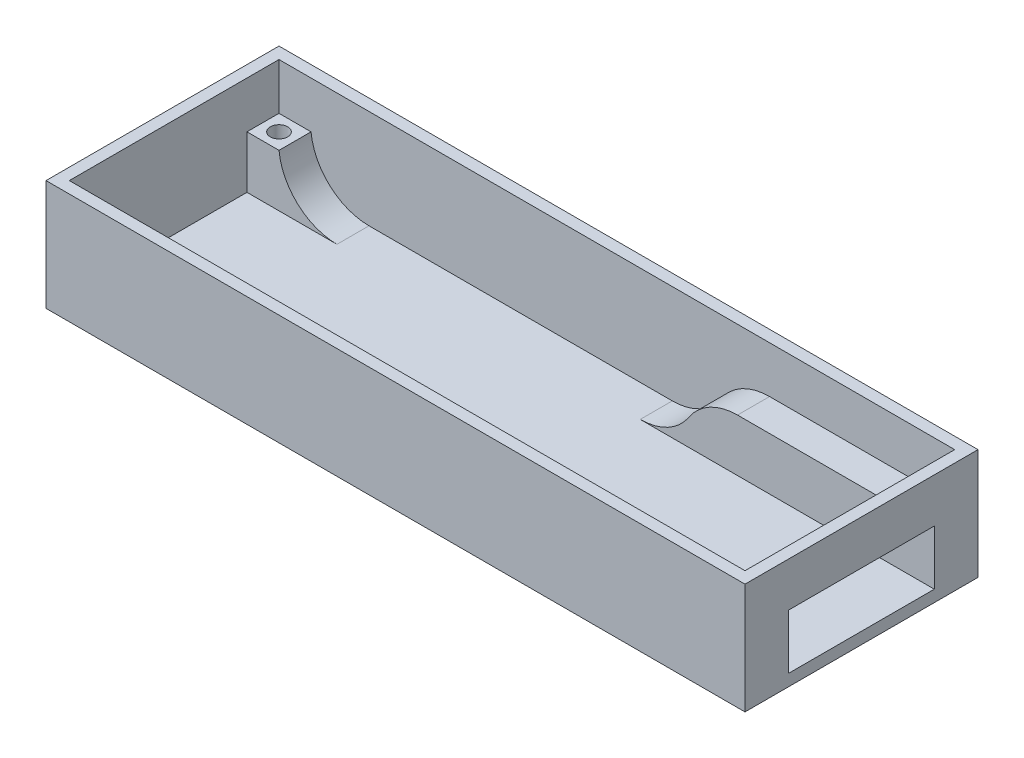
ISO-10303-21;
HEADER;
FILE_DESCRIPTION(('STEP AP214'),'2;1');
FILE_NAME('part.step','',(''),(''),'','','');
FILE_SCHEMA(('AUTOMOTIVE_DESIGN { 1 0 10303 214 1 1 1 1 }'));
ENDSEC;
DATA;
#1=APPLICATION_CONTEXT('core data for automotive mechanical design processes');
#2=APPLICATION_PROTOCOL_DEFINITION('international standard','automotive_design',2000,#1);
#3=PRODUCT_CONTEXT('',#1,'mechanical');
#4=PRODUCT('Part','Part','',(#3));
#5=PRODUCT_RELATED_PRODUCT_CATEGORY('part','',(#4));
#6=PRODUCT_DEFINITION_FORMATION('','',#4);
#7=PRODUCT_DEFINITION_CONTEXT('part definition',#1,'design');
#8=PRODUCT_DEFINITION('design','',#6,#7);
#9=PRODUCT_DEFINITION_SHAPE('','',#8);
#10=(LENGTH_UNIT() NAMED_UNIT(*) SI_UNIT(.MILLI.,.METRE.));
#11=(NAMED_UNIT(*) PLANE_ANGLE_UNIT() SI_UNIT($,.RADIAN.));
#12=(NAMED_UNIT(*) SI_UNIT($,.STERADIAN.) SOLID_ANGLE_UNIT());
#13=UNCERTAINTY_MEASURE_WITH_UNIT(LENGTH_MEASURE(1.E-05),#10,'distance_accuracy_value','');
#14=(GEOMETRIC_REPRESENTATION_CONTEXT(3) GLOBAL_UNCERTAINTY_ASSIGNED_CONTEXT((#13)) GLOBAL_UNIT_ASSIGNED_CONTEXT((#10,
#11,#12)) REPRESENTATION_CONTEXT('',''));
#15=CARTESIAN_POINT('',(0.,0.,0.));
#16=DIRECTION('',(0.,0.,1.));
#17=DIRECTION('',(1.,0.,0.));
#18=AXIS2_PLACEMENT_3D('',#15,#16,#17);
#19=CARTESIAN_POINT('',(29.,9.5,10.));
#20=DIRECTION('',(-1.,0.,0.));
#21=DIRECTION('',(0.,0.,1.));
#22=AXIS2_PLACEMENT_3D('',#19,#20,#21);
#23=PLANE('',#22);
#24=DIRECTION('',(0.,1.,0.));
#25=VECTOR('',#24,1.);
#26=CARTESIAN_POINT('',(29.,9.5,6.25));
#27=LINE('',#26,#25);
#28=CARTESIAN_POINT('',(29.,5.5,6.25));
#29=VERTEX_POINT('',#28);
#30=CARTESIAN_POINT('',(29.,5.7,6.25));
#31=VERTEX_POINT('',#30);
#32=EDGE_CURVE('E222',#29,#31,#27,.T.);
#33=ORIENTED_EDGE('',*,*,#32,.F.);
#34=DIRECTION('',(0.,0.,-1.));
#35=VECTOR('',#34,1.);
#36=CARTESIAN_POINT('',(29.,5.5,9.));
#37=LINE('',#36,#35);
#38=CARTESIAN_POINT('',(29.,5.5,9.));
#39=VERTEX_POINT('',#38);
#40=EDGE_CURVE('E207',#39,#29,#37,.T.);
#41=ORIENTED_EDGE('',*,*,#40,.F.);
#42=DIRECTION('',(0.,-1.,0.));
#43=VECTOR('',#42,1.);
#44=CARTESIAN_POINT('',(29.,9.5,9.));
#45=LINE('',#44,#43);
#46=CARTESIAN_POINT('',(29.,9.5,9.));
#47=VERTEX_POINT('',#46);
#48=EDGE_CURVE('E219',#47,#39,#45,.T.);
#49=ORIENTED_EDGE('',*,*,#48,.F.);
#50=DIRECTION('',(0.,0.,-1.));
#51=VECTOR('',#50,1.);
#52=CARTESIAN_POINT('',(29.,9.5,0.));
#53=LINE('',#52,#51);
#54=CARTESIAN_POINT('',(29.,9.5,-9.));
#55=VERTEX_POINT('',#54);
#56=EDGE_CURVE('E256',#47,#55,#53,.T.);
#57=ORIENTED_EDGE('',*,*,#56,.T.);
#58=DIRECTION('',(0.,-1.,0.));
#59=VECTOR('',#58,1.);
#60=CARTESIAN_POINT('',(29.,9.5,-9.));
#61=LINE('',#60,#59);
#62=CARTESIAN_POINT('',(29.,5.5,-9.));
#63=VERTEX_POINT('',#62);
#64=EDGE_CURVE('E233',#55,#63,#61,.T.);
#65=ORIENTED_EDGE('',*,*,#64,.T.);
#66=DIRECTION('',(0.,0.,-1.));
#67=VECTOR('',#66,1.);
#68=CARTESIAN_POINT('',(29.,5.5,-9.));
#69=LINE('',#68,#67);
#70=CARTESIAN_POINT('',(29.,5.5,-6.25));
#71=VERTEX_POINT('',#70);
#72=EDGE_CURVE('E446',#71,#63,#69,.T.);
#73=ORIENTED_EDGE('',*,*,#72,.F.);
#74=DIRECTION('',(0.,-1.,0.));
#75=VECTOR('',#74,1.);
#76=CARTESIAN_POINT('',(29.,9.5,-6.25));
#77=LINE('',#76,#75);
#78=CARTESIAN_POINT('',(29.,5.7,-6.25));
#79=VERTEX_POINT('',#78);
#80=EDGE_CURVE('E478',#79,#71,#77,.T.);
#81=ORIENTED_EDGE('',*,*,#80,.F.);
#82=DIRECTION('',(0.,0.,-1.));
#83=VECTOR('',#82,1.);
#84=CARTESIAN_POINT('',(29.,5.7,10.));
#85=LINE('',#84,#83);
#86=EDGE_CURVE('E303',#31,#79,#85,.T.);
#87=ORIENTED_EDGE('',*,*,#86,.F.);
#88=EDGE_LOOP('',(#33,#41,#49,#57,#65,#73,#81,#87));
#89=FACE_BOUND('',#88,.T.);
#90=ADVANCED_FACE('F39',(#89),#23,.T.);
#91=CARTESIAN_POINT('',(-30.,9.5,9.));
#92=DIRECTION('',(0.,0.,-1.));
#93=DIRECTION('',(-1.,0.,0.));
#94=AXIS2_PLACEMENT_3D('',#91,#92,#93);
#95=PLANE('',#94);
#96=DIRECTION('',(1.,0.,0.));
#97=VECTOR('',#96,1.);
#98=CARTESIAN_POINT('',(0.,1.,9.));
#99=LINE('',#98,#97);
#100=CARTESIAN_POINT('',(-21.2750628144669,1.,9.));
#101=VERTEX_POINT('',#100);
#102=CARTESIAN_POINT('',(4.75775468323431,1.,9.));
#103=VERTEX_POINT('',#102);
#104=EDGE_CURVE('E244',#101,#103,#99,.T.);
#105=ORIENTED_EDGE('',*,*,#104,.F.);
#106=CARTESIAN_POINT('',(-21.2750628144669,6.,9.));
#107=DIRECTION('',(0.,0.,-1.));
#108=DIRECTION('',(-1.,0.,0.));
#109=AXIS2_PLACEMENT_3D('',#106,#107,#108);
#110=CIRCLE('',#109,5.);
#111=CARTESIAN_POINT('',(-26.25,5.5,9.));
#112=VERTEX_POINT('',#111);
#113=EDGE_CURVE('E324',#101,#112,#110,.T.);
#114=ORIENTED_EDGE('',*,*,#113,.T.);
#115=DIRECTION('',(1.,0.,0.));
#116=VECTOR('',#115,1.);
#117=CARTESIAN_POINT('',(-29.,5.5,9.));
#118=LINE('',#117,#116);
#119=CARTESIAN_POINT('',(-29.,5.5,9.));
#120=VERTEX_POINT('',#119);
#121=EDGE_CURVE('E387',#120,#112,#118,.T.);
#122=ORIENTED_EDGE('',*,*,#121,.F.);
#123=DIRECTION('',(0.,-1.,0.));
#124=VECTOR('',#123,1.);
#125=CARTESIAN_POINT('',(-29.,9.5,9.));
#126=LINE('',#125,#124);
#127=CARTESIAN_POINT('',(-29.,9.5,9.));
#128=VERTEX_POINT('',#127);
#129=EDGE_CURVE('E232',#128,#120,#126,.T.);
#130=ORIENTED_EDGE('',*,*,#129,.F.);
#131=DIRECTION('',(1.,0.,0.));
#132=VECTOR('',#131,1.);
#133=CARTESIAN_POINT('',(0.,9.5,9.));
#134=LINE('',#133,#132);
#135=EDGE_CURVE('E230',#128,#47,#134,.T.);
#136=ORIENTED_EDGE('',*,*,#135,.T.);
#137=ORIENTED_EDGE('',*,*,#48,.T.);
#138=DIRECTION('',(1.,0.,0.));
#139=VECTOR('',#138,1.);
#140=CARTESIAN_POINT('',(29.,5.5,9.));
#141=LINE('',#140,#139);
#142=CARTESIAN_POINT('',(13.1094012274793,5.5,9.));
#143=VERTEX_POINT('',#142);
#144=EDGE_CURVE('E202',#143,#39,#141,.T.);
#145=ORIENTED_EDGE('',*,*,#144,.F.);
#146=CARTESIAN_POINT('',(13.1094012274793,0.5,9.));
#147=DIRECTION('',(0.,0.,-1.));
#148=DIRECTION('',(-1.,0.,0.));
#149=AXIS2_PLACEMENT_3D('',#146,#147,#148);
#150=CIRCLE('',#149,5.);
#151=CARTESIAN_POINT('',(8.93357795535683,3.25,9.));
#152=VERTEX_POINT('',#151);
#153=EDGE_CURVE('E48',#143,#152,#150,.F.);
#154=ORIENTED_EDGE('',*,*,#153,.T.);
#155=CARTESIAN_POINT('',(4.75775468323431,6.,9.));
#156=DIRECTION('',(0.,0.,-1.));
#157=DIRECTION('',(-1.,0.,0.));
#158=AXIS2_PLACEMENT_3D('',#155,#156,#157);
#159=CIRCLE('',#158,5.);
#160=EDGE_CURVE('E321',#152,#103,#159,.T.);
#161=ORIENTED_EDGE('',*,*,#160,.T.);
#162=EDGE_LOOP('',(#105,#114,#122,#130,#136,#137,#145,#154,#161));
#163=FACE_BOUND('',#162,.T.);
#164=ADVANCED_FACE('F227',(#163),#95,.T.);
#165=CARTESIAN_POINT('',(-30.,9.5,-9.));
#166=DIRECTION('',(0.,0.,1.));
#167=DIRECTION('',(1.,0.,0.));
#168=AXIS2_PLACEMENT_3D('',#165,#166,#167);
#169=PLANE('',#168);
#170=DIRECTION('',(-1.,0.,0.));
#171=VECTOR('',#170,1.);
#172=CARTESIAN_POINT('',(-29.,5.5,-9.));
#173=LINE('',#172,#171);
#174=CARTESIAN_POINT('',(-26.25,5.5,-9.));
#175=VERTEX_POINT('',#174);
#176=CARTESIAN_POINT('',(-29.,5.5,-9.));
#177=VERTEX_POINT('',#176);
#178=EDGE_CURVE('E431',#175,#177,#173,.T.);
#179=ORIENTED_EDGE('',*,*,#178,.F.);
#180=CARTESIAN_POINT('',(-21.2750628144669,6.,-9.));
#181=DIRECTION('',(0.,0.,1.));
#182=DIRECTION('',(1.,0.,0.));
#183=AXIS2_PLACEMENT_3D('',#180,#181,#182);
#184=CIRCLE('',#183,5.);
#185=CARTESIAN_POINT('',(-21.2750628144669,1.,-9.));
#186=VERTEX_POINT('',#185);
#187=EDGE_CURVE('E330',#175,#186,#184,.T.);
#188=ORIENTED_EDGE('',*,*,#187,.T.);
#189=DIRECTION('',(-1.,0.,0.));
#190=VECTOR('',#189,1.);
#191=CARTESIAN_POINT('',(0.,1.,-9.));
#192=LINE('',#191,#190);
#193=CARTESIAN_POINT('',(4.75775468323431,1.,-9.));
#194=VERTEX_POINT('',#193);
#195=EDGE_CURVE('E247',#194,#186,#192,.T.);
#196=ORIENTED_EDGE('',*,*,#195,.F.);
#197=CARTESIAN_POINT('',(4.75775468323431,6.,-9.));
#198=DIRECTION('',(0.,0.,1.));
#199=DIRECTION('',(1.,0.,0.));
#200=AXIS2_PLACEMENT_3D('',#197,#198,#199);
#201=CIRCLE('',#200,5.);
#202=CARTESIAN_POINT('',(8.93357795535683,3.25,-9.));
#203=VERTEX_POINT('',#202);
#204=EDGE_CURVE('E327',#194,#203,#201,.T.);
#205=ORIENTED_EDGE('',*,*,#204,.T.);
#206=CARTESIAN_POINT('',(13.1094012274793,0.5,-9.));
#207=DIRECTION('',(0.,0.,1.));
#208=DIRECTION('',(1.,0.,0.));
#209=AXIS2_PLACEMENT_3D('',#206,#207,#208);
#210=CIRCLE('',#209,5.);
#211=CARTESIAN_POINT('',(13.1094012274793,5.5,-9.));
#212=VERTEX_POINT('',#211);
#213=EDGE_CURVE('E11',#203,#212,#210,.F.);
#214=ORIENTED_EDGE('',*,*,#213,.T.);
#215=DIRECTION('',(-1.,0.,0.));
#216=VECTOR('',#215,1.);
#217=CARTESIAN_POINT('',(29.,5.5,-9.));
#218=LINE('',#217,#216);
#219=EDGE_CURVE('E452',#63,#212,#218,.T.);
#220=ORIENTED_EDGE('',*,*,#219,.F.);
#221=ORIENTED_EDGE('',*,*,#64,.F.);
#222=DIRECTION('',(-1.,0.,0.));
#223=VECTOR('',#222,1.);
#224=CARTESIAN_POINT('',(0.,9.5,-9.));
#225=LINE('',#224,#223);
#226=CARTESIAN_POINT('',(-29.,9.5,-9.));
#227=VERTEX_POINT('',#226);
#228=EDGE_CURVE('E259',#55,#227,#225,.T.);
#229=ORIENTED_EDGE('',*,*,#228,.T.);
#230=DIRECTION('',(0.,-1.,0.));
#231=VECTOR('',#230,1.);
#232=CARTESIAN_POINT('',(-29.,9.5,-9.));
#233=LINE('',#232,#231);
#234=EDGE_CURVE('E241',#227,#177,#233,.T.);
#235=ORIENTED_EDGE('',*,*,#234,.T.);
#236=EDGE_LOOP('',(#179,#188,#196,#205,#214,#220,#221,#229,#235));
#237=FACE_BOUND('',#236,.T.);
#238=ADVANCED_FACE('F500',(#237),#169,.T.);
#239=CARTESIAN_POINT('',(0.,9.5,0.));
#240=DIRECTION('',(0.,-1.,0.));
#241=DIRECTION('',(0.,0.,-1.));
#242=AXIS2_PLACEMENT_3D('',#239,#240,#241);
#243=PLANE('',#242);
#244=DIRECTION('',(0.,0.,1.));
#245=VECTOR('',#244,1.);
#246=CARTESIAN_POINT('',(-30.,9.5,10.));
#247=LINE('',#246,#245);
#248=CARTESIAN_POINT('',(-30.,9.5,-10.));
#249=VERTEX_POINT('',#248);
#250=CARTESIAN_POINT('',(-30.,9.5,10.));
#251=VERTEX_POINT('',#250);
#252=EDGE_CURVE('E262',#249,#251,#247,.T.);
#253=ORIENTED_EDGE('',*,*,#252,.T.);
#254=DIRECTION('',(1.,0.,0.));
#255=VECTOR('',#254,1.);
#256=CARTESIAN_POINT('',(-30.,9.5,10.));
#257=LINE('',#256,#255);
#258=CARTESIAN_POINT('',(30.,9.5,10.));
#259=VERTEX_POINT('',#258);
#260=EDGE_CURVE('E266',#251,#259,#257,.T.);
#261=ORIENTED_EDGE('',*,*,#260,.T.);
#262=DIRECTION('',(0.,0.,-1.));
#263=VECTOR('',#262,1.);
#264=CARTESIAN_POINT('',(30.,9.5,10.));
#265=LINE('',#264,#263);
#266=CARTESIAN_POINT('',(30.,9.5,-10.));
#267=VERTEX_POINT('',#266);
#268=EDGE_CURVE('E270',#259,#267,#265,.T.);
#269=ORIENTED_EDGE('',*,*,#268,.T.);
#270=DIRECTION('',(-1.,0.,0.));
#271=VECTOR('',#270,1.);
#272=CARTESIAN_POINT('',(-30.,9.5,-10.));
#273=LINE('',#272,#271);
#274=EDGE_CURVE('E273',#267,#249,#273,.T.);
#275=ORIENTED_EDGE('',*,*,#274,.T.);
#276=EDGE_LOOP('',(#253,#261,#269,#275));
#277=FACE_BOUND('',#276,.T.);
#278=DIRECTION('',(0.,0.,1.));
#279=VECTOR('',#278,1.);
#280=CARTESIAN_POINT('',(-29.,9.5,0.));
#281=LINE('',#280,#279);
#282=EDGE_CURVE('E251',#227,#128,#281,.T.);
#283=ORIENTED_EDGE('',*,*,#282,.F.);
#284=ORIENTED_EDGE('',*,*,#228,.F.);
#285=ORIENTED_EDGE('',*,*,#56,.F.);
#286=ORIENTED_EDGE('',*,*,#135,.F.);
#287=EDGE_LOOP('',(#283,#284,#285,#286));
#288=FACE_BOUND('',#287,.T.);
#289=ADVANCED_FACE('F530',(#277,#288),#243,.F.);
#290=CARTESIAN_POINT('',(-30.,9.5,10.));
#291=DIRECTION('',(1.,0.,0.));
#292=DIRECTION('',(0.,0.,-1.));
#293=AXIS2_PLACEMENT_3D('',#290,#291,#292);
#294=PLANE('',#293);
#295=DIRECTION('',(0.,0.,1.));
#296=VECTOR('',#295,1.);
#297=CARTESIAN_POINT('',(-30.,0.,10.));
#298=LINE('',#297,#296);
#299=CARTESIAN_POINT('',(-30.,0.,-10.));
#300=VERTEX_POINT('',#299);
#301=CARTESIAN_POINT('',(-30.,0.,10.));
#302=VERTEX_POINT('',#301);
#303=EDGE_CURVE('E238',#300,#302,#298,.T.);
#304=ORIENTED_EDGE('',*,*,#303,.T.);
#305=DIRECTION('',(0.,-1.,0.));
#306=VECTOR('',#305,1.);
#307=CARTESIAN_POINT('',(-30.,9.5,10.));
#308=LINE('',#307,#306);
#309=EDGE_CURVE('E299',#251,#302,#308,.T.);
#310=ORIENTED_EDGE('',*,*,#309,.F.);
#311=ORIENTED_EDGE('',*,*,#252,.F.);
#312=DIRECTION('',(0.,-1.,0.));
#313=VECTOR('',#312,1.);
#314=CARTESIAN_POINT('',(-30.,9.5,-10.));
#315=LINE('',#314,#313);
#316=EDGE_CURVE('E276',#249,#300,#315,.T.);
#317=ORIENTED_EDGE('',*,*,#316,.T.);
#318=EDGE_LOOP('',(#304,#310,#311,#317));
#319=FACE_BOUND('',#318,.T.);
#320=ADVANCED_FACE('F575',(#319),#294,.F.);
#321=CARTESIAN_POINT('',(-30.,9.5,10.));
#322=DIRECTION('',(0.,0.,-1.));
#323=DIRECTION('',(-1.,0.,0.));
#324=AXIS2_PLACEMENT_3D('',#321,#322,#323);
#325=PLANE('',#324);
#326=DIRECTION('',(1.,0.,0.));
#327=VECTOR('',#326,1.);
#328=CARTESIAN_POINT('',(-30.,0.,10.));
#329=LINE('',#328,#327);
#330=CARTESIAN_POINT('',(30.,0.,10.));
#331=VERTEX_POINT('',#330);
#332=EDGE_CURVE('E280',#302,#331,#329,.T.);
#333=ORIENTED_EDGE('',*,*,#332,.T.);
#334=DIRECTION('',(0.,-1.,0.));
#335=VECTOR('',#334,1.);
#336=CARTESIAN_POINT('',(30.,9.5,10.));
#337=LINE('',#336,#335);
#338=EDGE_CURVE('E295',#259,#331,#337,.T.);
#339=ORIENTED_EDGE('',*,*,#338,.F.);
#340=ORIENTED_EDGE('',*,*,#260,.F.);
#341=ORIENTED_EDGE('',*,*,#309,.T.);
#342=EDGE_LOOP('',(#333,#339,#340,#341));
#343=FACE_BOUND('',#342,.T.);
#344=ADVANCED_FACE('F588',(#343),#325,.F.);
#345=CARTESIAN_POINT('',(30.,9.5,10.));
#346=DIRECTION('',(-1.,0.,0.));
#347=DIRECTION('',(0.,0.,1.));
#348=AXIS2_PLACEMENT_3D('',#345,#346,#347);
#349=PLANE('',#348);
#350=DIRECTION('',(0.,1.,0.));
#351=VECTOR('',#350,1.);
#352=CARTESIAN_POINT('',(30.,5.7,-6.25));
#353=LINE('',#352,#351);
#354=CARTESIAN_POINT('',(30.,1.,-6.25));
#355=VERTEX_POINT('',#354);
#356=CARTESIAN_POINT('',(30.,5.7,-6.25));
#357=VERTEX_POINT('',#356);
#358=EDGE_CURVE('E462',#355,#357,#353,.T.);
#359=ORIENTED_EDGE('',*,*,#358,.F.);
#360=DIRECTION('',(0.,0.,-1.));
#361=VECTOR('',#360,1.);
#362=CARTESIAN_POINT('',(30.,1.,-6.25));
#363=LINE('',#362,#361);
#364=CARTESIAN_POINT('',(30.,1.,6.25));
#365=VERTEX_POINT('',#364);
#366=EDGE_CURVE('E459',#365,#355,#363,.T.);
#367=ORIENTED_EDGE('',*,*,#366,.F.);
#368=DIRECTION('',(0.,-1.,0.));
#369=VECTOR('',#368,1.);
#370=CARTESIAN_POINT('',(30.,5.7,6.25));
#371=LINE('',#370,#369);
#372=CARTESIAN_POINT('',(30.,5.7,6.25));
#373=VERTEX_POINT('',#372);
#374=EDGE_CURVE('E470',#373,#365,#371,.T.);
#375=ORIENTED_EDGE('',*,*,#374,.F.);
#376=DIRECTION('',(0.,0.,1.));
#377=VECTOR('',#376,1.);
#378=CARTESIAN_POINT('',(30.,5.7,6.25));
#379=LINE('',#378,#377);
#380=EDGE_CURVE('E466',#357,#373,#379,.T.);
#381=ORIENTED_EDGE('',*,*,#380,.F.);
#382=EDGE_LOOP('',(#359,#367,#375,#381));
#383=FACE_BOUND('',#382,.T.);
#384=DIRECTION('',(0.,0.,-1.));
#385=VECTOR('',#384,1.);
#386=CARTESIAN_POINT('',(30.,0.,10.));
#387=LINE('',#386,#385);
#388=CARTESIAN_POINT('',(30.,0.,-10.));
#389=VERTEX_POINT('',#388);
#390=EDGE_CURVE('E283',#331,#389,#387,.T.);
#391=ORIENTED_EDGE('',*,*,#390,.T.);
#392=DIRECTION('',(0.,-1.,0.));
#393=VECTOR('',#392,1.);
#394=CARTESIAN_POINT('',(30.,9.5,-10.));
#395=LINE('',#394,#393);
#396=EDGE_CURVE('E291',#267,#389,#395,.T.);
#397=ORIENTED_EDGE('',*,*,#396,.F.);
#398=ORIENTED_EDGE('',*,*,#268,.F.);
#399=ORIENTED_EDGE('',*,*,#338,.T.);
#400=EDGE_LOOP('',(#391,#397,#398,#399));
#401=FACE_BOUND('',#400,.T.);
#402=ADVANCED_FACE('F584',(#383,#401),#349,.F.);
#403=CARTESIAN_POINT('',(-30.,9.5,-10.));
#404=DIRECTION('',(0.,0.,1.));
#405=DIRECTION('',(1.,0.,0.));
#406=AXIS2_PLACEMENT_3D('',#403,#404,#405);
#407=PLANE('',#406);
#408=DIRECTION('',(-1.,0.,0.));
#409=VECTOR('',#408,1.);
#410=CARTESIAN_POINT('',(-30.,0.,-10.));
#411=LINE('',#410,#409);
#412=EDGE_CURVE('E267',#389,#300,#411,.T.);
#413=ORIENTED_EDGE('',*,*,#412,.T.);
#414=ORIENTED_EDGE('',*,*,#316,.F.);
#415=ORIENTED_EDGE('',*,*,#274,.F.);
#416=ORIENTED_EDGE('',*,*,#396,.T.);
#417=EDGE_LOOP('',(#413,#414,#415,#416));
#418=FACE_BOUND('',#417,.T.);
#419=ADVANCED_FACE('F580',(#418),#407,.F.);
#420=CARTESIAN_POINT('',(0.,0.,0.));
#421=DIRECTION('',(0.,-1.,0.));
#422=DIRECTION('',(0.,0.,-1.));
#423=AXIS2_PLACEMENT_3D('',#420,#421,#422);
#424=PLANE('',#423);
#425=ORIENTED_EDGE('',*,*,#303,.F.);
#426=ORIENTED_EDGE('',*,*,#412,.F.);
#427=ORIENTED_EDGE('',*,*,#390,.F.);
#428=ORIENTED_EDGE('',*,*,#332,.F.);
#429=EDGE_LOOP('',(#425,#426,#427,#428));
#430=FACE_BOUND('',#429,.T.);
#431=ADVANCED_FACE('F577',(#430),#424,.T.);
#432=CARTESIAN_POINT('',(-29.,9.5,10.));
#433=DIRECTION('',(1.,0.,0.));
#434=DIRECTION('',(0.,0.,-1.));
#435=AXIS2_PLACEMENT_3D('',#432,#433,#434);
#436=PLANE('',#435);
#437=DIRECTION('',(0.,0.,1.));
#438=VECTOR('',#437,1.);
#439=CARTESIAN_POINT('',(-29.,5.5,9.));
#440=LINE('',#439,#438);
#441=CARTESIAN_POINT('',(-29.,5.5,6.25));
#442=VERTEX_POINT('',#441);
#443=EDGE_CURVE('E399',#442,#120,#440,.T.);
#444=ORIENTED_EDGE('',*,*,#443,.F.);
#445=DIRECTION('',(0.,-1.,0.));
#446=VECTOR('',#445,1.);
#447=CARTESIAN_POINT('',(-29.,5.5,6.25));
#448=LINE('',#447,#446);
#449=CARTESIAN_POINT('',(-29.,1.,6.25));
#450=VERTEX_POINT('',#449);
#451=EDGE_CURVE('E403',#442,#450,#448,.T.);
#452=ORIENTED_EDGE('',*,*,#451,.T.);
#453=DIRECTION('',(0.,0.,1.));
#454=VECTOR('',#453,1.);
#455=CARTESIAN_POINT('',(-29.,1.,0.));
#456=LINE('',#455,#454);
#457=CARTESIAN_POINT('',(-29.,1.,-6.25));
#458=VERTEX_POINT('',#457);
#459=EDGE_CURVE('E493',#458,#450,#456,.T.);
#460=ORIENTED_EDGE('',*,*,#459,.F.);
#461=DIRECTION('',(0.,-1.,0.));
#462=VECTOR('',#461,1.);
#463=CARTESIAN_POINT('',(-29.,5.5,-6.25));
#464=LINE('',#463,#462);
#465=CARTESIAN_POINT('',(-29.,5.5,-6.25));
#466=VERTEX_POINT('',#465);
#467=EDGE_CURVE('E435',#466,#458,#464,.T.);
#468=ORIENTED_EDGE('',*,*,#467,.F.);
#469=DIRECTION('',(0.,0.,1.));
#470=VECTOR('',#469,1.);
#471=CARTESIAN_POINT('',(-29.,5.5,-9.));
#472=LINE('',#471,#470);
#473=EDGE_CURVE('E419',#177,#466,#472,.T.);
#474=ORIENTED_EDGE('',*,*,#473,.F.);
#475=ORIENTED_EDGE('',*,*,#234,.F.);
#476=ORIENTED_EDGE('',*,*,#282,.T.);
#477=ORIENTED_EDGE('',*,*,#129,.T.);
#478=EDGE_LOOP('',(#444,#452,#460,#468,#474,#475,#476,#477));
#479=FACE_BOUND('',#478,.T.);
#480=ADVANCED_FACE('F531',(#479),#436,.T.);
#481=CARTESIAN_POINT('',(0.,1.,0.));
#482=DIRECTION('',(0.,-1.,0.));
#483=DIRECTION('',(0.,0.,-1.));
#484=AXIS2_PLACEMENT_3D('',#481,#482,#483);
#485=PLANE('',#484);
#486=DIRECTION('',(-1.,0.,0.));
#487=VECTOR('',#486,1.);
#488=CARTESIAN_POINT('',(-29.,1.,6.25));
#489=LINE('',#488,#487);
#490=CARTESIAN_POINT('',(-21.2750628144669,1.,6.25));
#491=VERTEX_POINT('',#490);
#492=EDGE_CURVE('E385',#491,#450,#489,.T.);
#493=ORIENTED_EDGE('',*,*,#492,.F.);
#494=DIRECTION('',(0.,0.,-1.));
#495=VECTOR('',#494,1.);
#496=CARTESIAN_POINT('',(-21.2750628144669,1.,0.));
#497=LINE('',#496,#495);
#498=EDGE_CURVE('E318',#491,#101,#497,.F.);
#499=ORIENTED_EDGE('',*,*,#498,.T.);
#500=ORIENTED_EDGE('',*,*,#104,.T.);
#501=DIRECTION('',(0.,0.,-1.));
#502=VECTOR('',#501,1.);
#503=CARTESIAN_POINT('',(4.75775468323431,1.,0.));
#504=LINE('',#503,#502);
#505=CARTESIAN_POINT('',(4.75775468323431,1.,6.25));
#506=VERTEX_POINT('',#505);
#507=EDGE_CURVE('E310',#103,#506,#504,.T.);
#508=ORIENTED_EDGE('',*,*,#507,.T.);
#509=DIRECTION('',(1.,0.,0.));
#510=VECTOR('',#509,1.);
#511=CARTESIAN_POINT('',(18.,1.,6.25));
#512=LINE('',#511,#510);
#513=EDGE_CURVE('E475',#506,#365,#512,.T.);
#514=ORIENTED_EDGE('',*,*,#513,.T.);
#515=ORIENTED_EDGE('',*,*,#366,.T.);
#516=DIRECTION('',(1.,0.,0.));
#517=VECTOR('',#516,1.);
#518=CARTESIAN_POINT('',(18.,1.,-6.25));
#519=LINE('',#518,#517);
#520=CARTESIAN_POINT('',(4.75775468323431,1.,-6.25));
#521=VERTEX_POINT('',#520);
#522=EDGE_CURVE('E474',#521,#355,#519,.T.);
#523=ORIENTED_EDGE('',*,*,#522,.F.);
#524=DIRECTION('',(0.,0.,-1.));
#525=VECTOR('',#524,1.);
#526=CARTESIAN_POINT('',(4.75775468323431,1.,0.));
#527=LINE('',#526,#525);
#528=EDGE_CURVE('E307',#521,#194,#527,.T.);
#529=ORIENTED_EDGE('',*,*,#528,.T.);
#530=ORIENTED_EDGE('',*,*,#195,.T.);
#531=DIRECTION('',(0.,0.,-1.));
#532=VECTOR('',#531,1.);
#533=CARTESIAN_POINT('',(-21.2750628144669,1.,0.));
#534=LINE('',#533,#532);
#535=CARTESIAN_POINT('',(-21.2750628144669,1.,-6.25));
#536=VERTEX_POINT('',#535);
#537=EDGE_CURVE('E314',#186,#536,#534,.F.);
#538=ORIENTED_EDGE('',*,*,#537,.T.);
#539=DIRECTION('',(1.,0.,0.));
#540=VECTOR('',#539,1.);
#541=CARTESIAN_POINT('',(-29.,1.,-6.25));
#542=LINE('',#541,#540);
#543=EDGE_CURVE('E415',#458,#536,#542,.T.);
#544=ORIENTED_EDGE('',*,*,#543,.F.);
#545=ORIENTED_EDGE('',*,*,#459,.T.);
#546=EDGE_LOOP('',(#493,#499,#500,#508,#514,#515,#523,#529,#530,#538,#544,#545));
#547=FACE_BOUND('',#546,.T.);
#548=ADVANCED_FACE('F515',(#547),#485,.F.);
#549=CARTESIAN_POINT('',(18.,5.7,6.25));
#550=DIRECTION('',(0.,0.,1.));
#551=DIRECTION('',(0.,-1.,0.));
#552=AXIS2_PLACEMENT_3D('',#549,#550,#551);
#553=PLANE('',#552);
#554=CARTESIAN_POINT('',(4.75775468323431,6.,6.25));
#555=DIRECTION('',(0.,0.,1.));
#556=DIRECTION('',(0.,-1.,0.));
#557=AXIS2_PLACEMENT_3D('',#554,#555,#556);
#558=CIRCLE('',#557,5.);
#559=CARTESIAN_POINT('',(8.93357795535683,3.25,6.25));
#560=VERTEX_POINT('',#559);
#561=EDGE_CURVE('E340',#506,#560,#558,.T.);
#562=ORIENTED_EDGE('',*,*,#561,.T.);
#563=CARTESIAN_POINT('',(13.1094012274793,0.5,6.25));
#564=DIRECTION('',(0.,0.,1.));
#565=DIRECTION('',(0.,-1.,0.));
#566=AXIS2_PLACEMENT_3D('',#563,#564,#565);
#567=CIRCLE('',#566,5.);
#568=CARTESIAN_POINT('',(13.1094012274793,5.5,6.25));
#569=VERTEX_POINT('',#568);
#570=EDGE_CURVE('E352',#560,#569,#567,.F.);
#571=ORIENTED_EDGE('',*,*,#570,.T.);
#572=DIRECTION('',(-1.,0.,0.));
#573=VECTOR('',#572,1.);
#574=CARTESIAN_POINT('',(29.,5.5,6.25));
#575=LINE('',#574,#573);
#576=EDGE_CURVE('E224',#29,#569,#575,.T.);
#577=ORIENTED_EDGE('',*,*,#576,.F.);
#578=ORIENTED_EDGE('',*,*,#32,.T.);
#579=DIRECTION('',(1.,0.,0.));
#580=VECTOR('',#579,1.);
#581=CARTESIAN_POINT('',(18.,5.7,6.25));
#582=LINE('',#581,#580);
#583=EDGE_CURVE('E479',#31,#373,#582,.T.);
#584=ORIENTED_EDGE('',*,*,#583,.T.);
#585=ORIENTED_EDGE('',*,*,#374,.T.);
#586=ORIENTED_EDGE('',*,*,#513,.F.);
#587=EDGE_LOOP('',(#562,#571,#577,#578,#584,#585,#586));
#588=FACE_BOUND('',#587,.T.);
#589=ADVANCED_FACE('F374',(#588),#553,.F.);
#590=CARTESIAN_POINT('',(18.,5.7,6.25));
#591=DIRECTION('',(0.,1.,0.));
#592=DIRECTION('',(0.,0.,1.));
#593=AXIS2_PLACEMENT_3D('',#590,#591,#592);
#594=PLANE('',#593);
#595=ORIENTED_EDGE('',*,*,#86,.T.);
#596=DIRECTION('',(1.,0.,0.));
#597=VECTOR('',#596,1.);
#598=CARTESIAN_POINT('',(18.,5.7,-6.25));
#599=LINE('',#598,#597);
#600=EDGE_CURVE('E482',#79,#357,#599,.T.);
#601=ORIENTED_EDGE('',*,*,#600,.T.);
#602=ORIENTED_EDGE('',*,*,#380,.T.);
#603=ORIENTED_EDGE('',*,*,#583,.F.);
#604=EDGE_LOOP('',(#595,#601,#602,#603));
#605=FACE_BOUND('',#604,.T.);
#606=ADVANCED_FACE('F660',(#605),#594,.F.);
#607=CARTESIAN_POINT('',(18.,5.7,-6.25));
#608=DIRECTION('',(0.,0.,-1.));
#609=DIRECTION('',(-1.,0.,0.));
#610=AXIS2_PLACEMENT_3D('',#607,#608,#609);
#611=PLANE('',#610);
#612=DIRECTION('',(1.,0.,0.));
#613=VECTOR('',#612,1.);
#614=CARTESIAN_POINT('',(29.,5.5,-6.25));
#615=LINE('',#614,#613);
#616=CARTESIAN_POINT('',(13.1094012274793,5.5,-6.25));
#617=VERTEX_POINT('',#616);
#618=EDGE_CURVE('E456',#617,#71,#615,.T.);
#619=ORIENTED_EDGE('',*,*,#618,.F.);
#620=CARTESIAN_POINT('',(13.1094012274793,0.5,-6.25));
#621=DIRECTION('',(0.,0.,-1.));
#622=DIRECTION('',(-1.,0.,0.));
#623=AXIS2_PLACEMENT_3D('',#620,#621,#622);
#624=CIRCLE('',#623,5.);
#625=CARTESIAN_POINT('',(8.93357795535683,3.25,-6.25));
#626=VERTEX_POINT('',#625);
#627=EDGE_CURVE('E63',#617,#626,#624,.F.);
#628=ORIENTED_EDGE('',*,*,#627,.T.);
#629=CARTESIAN_POINT('',(4.75775468323431,6.,-6.25));
#630=DIRECTION('',(0.,0.,-1.));
#631=DIRECTION('',(-1.,0.,0.));
#632=AXIS2_PLACEMENT_3D('',#629,#630,#631);
#633=CIRCLE('',#632,5.);
#634=EDGE_CURVE('E344',#626,#521,#633,.T.);
#635=ORIENTED_EDGE('',*,*,#634,.T.);
#636=ORIENTED_EDGE('',*,*,#522,.T.);
#637=ORIENTED_EDGE('',*,*,#358,.T.);
#638=ORIENTED_EDGE('',*,*,#600,.F.);
#639=ORIENTED_EDGE('',*,*,#80,.T.);
#640=EDGE_LOOP('',(#619,#628,#635,#636,#637,#638,#639));
#641=FACE_BOUND('',#640,.T.);
#642=ADVANCED_FACE('F527',(#641),#611,.F.);
#643=CARTESIAN_POINT('',(0.,5.5,0.));
#644=DIRECTION('',(0.,-1.,0.));
#645=DIRECTION('',(0.,0.,-1.));
#646=AXIS2_PLACEMENT_3D('',#643,#644,#645);
#647=PLANE('',#646);
#648=ORIENTED_EDGE('',*,*,#219,.T.);
#649=DIRECTION('',(0.,0.,-1.));
#650=VECTOR('',#649,1.);
#651=CARTESIAN_POINT('',(13.1094012274793,5.5,0.));
#652=LINE('',#651,#650);
#653=EDGE_CURVE('E355',#212,#617,#652,.F.);
#654=ORIENTED_EDGE('',*,*,#653,.T.);
#655=ORIENTED_EDGE('',*,*,#618,.T.);
#656=ORIENTED_EDGE('',*,*,#72,.T.);
#657=EDGE_LOOP('',(#648,#654,#655,#656));
#658=FACE_BOUND('',#657,.T.);
#659=CARTESIAN_POINT('',(26.5,5.5,-7.625));
#660=DIRECTION('',(0.,1.,0.));
#661=DIRECTION('',(0.,0.,1.));
#662=AXIS2_PLACEMENT_3D('',#659,#660,#661);
#663=CIRCLE('',#662,0.750000000000002);
#664=CARTESIAN_POINT('',(26.5,5.5,-6.875));
#665=VERTEX_POINT('',#664);
#666=EDGE_CURVE('E442',#665,#665,#663,.T.);
#667=ORIENTED_EDGE('',*,*,#666,.F.);
#668=EDGE_LOOP('',(#667));
#669=FACE_BOUND('',#668,.T.);
#670=ADVANCED_FACE('F524',(#658,#669),#647,.F.);
#671=CARTESIAN_POINT('',(26.5,5.5,-7.625));
#672=DIRECTION('',(0.,-1.,0.));
#673=DIRECTION('',(0.,0.,-1.));
#674=AXIS2_PLACEMENT_3D('',#671,#672,#673);
#675=CYLINDRICAL_SURFACE('',#674,0.750000000000002);
#676=ORIENTED_EDGE('',*,*,#666,.T.);
#677=EDGE_LOOP('',(#676));
#678=FACE_BOUND('',#677,.T.);
#679=CARTESIAN_POINT('',(26.5,1.,-7.625));
#680=DIRECTION('',(0.,1.,0.));
#681=DIRECTION('',(0.,0.,1.));
#682=AXIS2_PLACEMENT_3D('',#679,#680,#681);
#683=CIRCLE('',#682,0.750000000000002);
#684=CARTESIAN_POINT('',(26.5,1.,-6.875));
#685=VERTEX_POINT('',#684);
#686=EDGE_CURVE('E441',#685,#685,#683,.T.);
#687=ORIENTED_EDGE('',*,*,#686,.F.);
#688=EDGE_LOOP('',(#687));
#689=FACE_BOUND('',#688,.T.);
#690=ADVANCED_FACE('F649',(#678,#689),#675,.F.);
#691=ORIENTED_EDGE('',*,*,#686,.T.);
#692=EDGE_LOOP('',(#691));
#693=FACE_BOUND('',#692,.T.);
#694=ADVANCED_FACE('F557',(#693),#485,.F.);
#695=CARTESIAN_POINT('',(0.,5.5,0.));
#696=DIRECTION('',(0.,1.,0.));
#697=DIRECTION('',(0.,0.,1.));
#698=AXIS2_PLACEMENT_3D('',#695,#696,#697);
#699=PLANE('',#698);
#700=ORIENTED_EDGE('',*,*,#473,.T.);
#701=DIRECTION('',(1.,0.,0.));
#702=VECTOR('',#701,1.);
#703=CARTESIAN_POINT('',(-29.,5.5,-6.25));
#704=LINE('',#703,#702);
#705=CARTESIAN_POINT('',(-26.25,5.5,-6.25));
#706=VERTEX_POINT('',#705);
#707=EDGE_CURVE('E423',#466,#706,#704,.T.);
#708=ORIENTED_EDGE('',*,*,#707,.T.);
#709=DIRECTION('',(0.,0.,-1.));
#710=VECTOR('',#709,1.);
#711=CARTESIAN_POINT('',(-26.25,5.5,-9.));
#712=LINE('',#711,#710);
#713=EDGE_CURVE('E427',#706,#175,#712,.T.);
#714=ORIENTED_EDGE('',*,*,#713,.T.);
#715=ORIENTED_EDGE('',*,*,#178,.T.);
#716=EDGE_LOOP('',(#700,#708,#714,#715));
#717=FACE_BOUND('',#716,.T.);
#718=CARTESIAN_POINT('',(-27.625,5.5,-7.625));
#719=DIRECTION('',(0.,1.,0.));
#720=DIRECTION('',(0.,0.,1.));
#721=AXIS2_PLACEMENT_3D('',#718,#719,#720);
#722=CIRCLE('',#721,0.750000000000002);
#723=CARTESIAN_POINT('',(-27.625,5.5,-6.875));
#724=VERTEX_POINT('',#723);
#725=EDGE_CURVE('E411',#724,#724,#722,.T.);
#726=ORIENTED_EDGE('',*,*,#725,.F.);
#727=EDGE_LOOP('',(#726));
#728=FACE_BOUND('',#727,.T.);
#729=ADVANCED_FACE('F505',(#717,#728),#699,.T.);
#730=CARTESIAN_POINT('',(-29.,5.5,-6.25));
#731=DIRECTION('',(0.,0.,-1.));
#732=DIRECTION('',(-1.,0.,0.));
#733=AXIS2_PLACEMENT_3D('',#730,#731,#732);
#734=PLANE('',#733);
#735=ORIENTED_EDGE('',*,*,#543,.T.);
#736=CARTESIAN_POINT('',(-21.2750628144669,6.,-6.25));
#737=DIRECTION('',(0.,0.,-1.));
#738=DIRECTION('',(-1.,0.,0.));
#739=AXIS2_PLACEMENT_3D('',#736,#737,#738);
#740=CIRCLE('',#739,5.);
#741=EDGE_CURVE('E337',#536,#706,#740,.T.);
#742=ORIENTED_EDGE('',*,*,#741,.T.);
#743=ORIENTED_EDGE('',*,*,#707,.F.);
#744=ORIENTED_EDGE('',*,*,#467,.T.);
#745=EDGE_LOOP('',(#735,#742,#743,#744));
#746=FACE_BOUND('',#745,.T.);
#747=ADVANCED_FACE('F546',(#746),#734,.F.);
#748=CARTESIAN_POINT('',(-27.625,5.5,-7.625));
#749=DIRECTION('',(0.,-1.,0.));
#750=DIRECTION('',(0.,0.,-1.));
#751=AXIS2_PLACEMENT_3D('',#748,#749,#750);
#752=CYLINDRICAL_SURFACE('',#751,0.750000000000002);
#753=ORIENTED_EDGE('',*,*,#725,.T.);
#754=EDGE_LOOP('',(#753));
#755=FACE_BOUND('',#754,.T.);
#756=CARTESIAN_POINT('',(-27.625,1.,-7.625));
#757=DIRECTION('',(0.,1.,0.));
#758=DIRECTION('',(0.,0.,1.));
#759=AXIS2_PLACEMENT_3D('',#756,#757,#758);
#760=CIRCLE('',#759,0.750000000000002);
#761=CARTESIAN_POINT('',(-27.625,1.,-6.875));
#762=VERTEX_POINT('',#761);
#763=EDGE_CURVE('E410',#762,#762,#760,.T.);
#764=ORIENTED_EDGE('',*,*,#763,.F.);
#765=EDGE_LOOP('',(#764));
#766=FACE_BOUND('',#765,.T.);
#767=ADVANCED_FACE('F548',(#755,#766),#752,.F.);
#768=ORIENTED_EDGE('',*,*,#763,.T.);
#769=EDGE_LOOP('',(#768));
#770=FACE_BOUND('',#769,.T.);
#771=ADVANCED_FACE('F554',(#770),#485,.F.);
#772=CARTESIAN_POINT('',(0.,5.5,0.));
#773=DIRECTION('',(0.,1.,0.));
#774=DIRECTION('',(0.,0.,1.));
#775=AXIS2_PLACEMENT_3D('',#772,#773,#774);
#776=PLANE('',#775);
#777=ORIENTED_EDGE('',*,*,#121,.T.);
#778=DIRECTION('',(0.,0.,-1.));
#779=VECTOR('',#778,1.);
#780=CARTESIAN_POINT('',(-26.25,5.5,9.));
#781=LINE('',#780,#779);
#782=CARTESIAN_POINT('',(-26.25,5.5,6.25));
#783=VERTEX_POINT('',#782);
#784=EDGE_CURVE('E391',#112,#783,#781,.T.);
#785=ORIENTED_EDGE('',*,*,#784,.T.);
#786=DIRECTION('',(-1.,0.,0.));
#787=VECTOR('',#786,1.);
#788=CARTESIAN_POINT('',(-29.,5.5,6.25));
#789=LINE('',#788,#787);
#790=EDGE_CURVE('E395',#783,#442,#789,.T.);
#791=ORIENTED_EDGE('',*,*,#790,.T.);
#792=ORIENTED_EDGE('',*,*,#443,.T.);
#793=EDGE_LOOP('',(#777,#785,#791,#792));
#794=FACE_BOUND('',#793,.T.);
#795=CARTESIAN_POINT('',(-27.625,5.5,7.625));
#796=DIRECTION('',(0.,1.,0.));
#797=DIRECTION('',(0.,0.,-1.));
#798=AXIS2_PLACEMENT_3D('',#795,#796,#797);
#799=CIRCLE('',#798,0.750000000000002);
#800=CARTESIAN_POINT('',(-27.625,5.5,6.875));
#801=VERTEX_POINT('',#800);
#802=EDGE_CURVE('E380',#801,#801,#799,.T.);
#803=ORIENTED_EDGE('',*,*,#802,.F.);
#804=EDGE_LOOP('',(#803));
#805=FACE_BOUND('',#804,.T.);
#806=ADVANCED_FACE('F535',(#794,#805),#776,.T.);
#807=CARTESIAN_POINT('',(-29.,5.5,6.25));
#808=DIRECTION('',(0.,0.,1.));
#809=DIRECTION('',(1.,0.,0.));
#810=AXIS2_PLACEMENT_3D('',#807,#808,#809);
#811=PLANE('',#810);
#812=ORIENTED_EDGE('',*,*,#492,.T.);
#813=ORIENTED_EDGE('',*,*,#451,.F.);
#814=ORIENTED_EDGE('',*,*,#790,.F.);
#815=CARTESIAN_POINT('',(-21.2750628144669,6.,6.25));
#816=DIRECTION('',(0.,0.,1.));
#817=DIRECTION('',(1.,0.,0.));
#818=AXIS2_PLACEMENT_3D('',#815,#816,#817);
#819=CIRCLE('',#818,5.);
#820=EDGE_CURVE('E333',#783,#491,#819,.T.);
#821=ORIENTED_EDGE('',*,*,#820,.T.);
#822=EDGE_LOOP('',(#812,#813,#814,#821));
#823=FACE_BOUND('',#822,.T.);
#824=ADVANCED_FACE('F542',(#823),#811,.F.);
#825=CARTESIAN_POINT('',(-27.625,5.5,7.625));
#826=DIRECTION('',(0.,-1.,0.));
#827=DIRECTION('',(0.,0.,-1.));
#828=AXIS2_PLACEMENT_3D('',#825,#826,#827);
#829=CYLINDRICAL_SURFACE('',#828,0.750000000000002);
#830=ORIENTED_EDGE('',*,*,#802,.T.);
#831=EDGE_LOOP('',(#830));
#832=FACE_BOUND('',#831,.T.);
#833=CARTESIAN_POINT('',(-27.625,1.,7.625));
#834=DIRECTION('',(0.,1.,0.));
#835=DIRECTION('',(0.,0.,-1.));
#836=AXIS2_PLACEMENT_3D('',#833,#834,#835);
#837=CIRCLE('',#836,0.750000000000002);
#838=CARTESIAN_POINT('',(-27.625,1.,6.875));
#839=VERTEX_POINT('',#838);
#840=EDGE_CURVE('E376',#839,#839,#837,.T.);
#841=ORIENTED_EDGE('',*,*,#840,.F.);
#842=EDGE_LOOP('',(#841));
#843=FACE_BOUND('',#842,.T.);
#844=ADVANCED_FACE('F708',(#832,#843),#829,.F.);
#845=ORIENTED_EDGE('',*,*,#840,.T.);
#846=EDGE_LOOP('',(#845));
#847=FACE_BOUND('',#846,.T.);
#848=ADVANCED_FACE('F636',(#847),#485,.F.);
#849=CARTESIAN_POINT('',(0.,5.5,0.));
#850=DIRECTION('',(0.,-1.,0.));
#851=DIRECTION('',(0.,0.,-1.));
#852=AXIS2_PLACEMENT_3D('',#849,#850,#851);
#853=PLANE('',#852);
#854=ORIENTED_EDGE('',*,*,#576,.T.);
#855=DIRECTION('',(0.,0.,-1.));
#856=VECTOR('',#855,1.);
#857=CARTESIAN_POINT('',(13.1094012274793,5.5,0.));
#858=LINE('',#857,#856);
#859=EDGE_CURVE('E210',#569,#143,#858,.F.);
#860=ORIENTED_EDGE('',*,*,#859,.T.);
#861=ORIENTED_EDGE('',*,*,#144,.T.);
#862=ORIENTED_EDGE('',*,*,#40,.T.);
#863=EDGE_LOOP('',(#854,#860,#861,#862));
#864=FACE_BOUND('',#863,.T.);
#865=CARTESIAN_POINT('',(26.5,5.5,7.625));
#866=DIRECTION('',(0.,1.,0.));
#867=DIRECTION('',(0.,0.,-1.));
#868=AXIS2_PLACEMENT_3D('',#865,#866,#867);
#869=CIRCLE('',#868,0.750000000000002);
#870=CARTESIAN_POINT('',(26.5,5.5,6.875));
#871=VERTEX_POINT('',#870);
#872=EDGE_CURVE('E214',#871,#871,#869,.T.);
#873=ORIENTED_EDGE('',*,*,#872,.F.);
#874=EDGE_LOOP('',(#873));
#875=FACE_BOUND('',#874,.T.);
#876=ADVANCED_FACE('F205',(#864,#875),#853,.F.);
#877=CARTESIAN_POINT('',(26.5,5.5,7.625));
#878=DIRECTION('',(0.,-1.,0.));
#879=DIRECTION('',(0.,0.,-1.));
#880=AXIS2_PLACEMENT_3D('',#877,#878,#879);
#881=CYLINDRICAL_SURFACE('',#880,0.750000000000002);
#882=ORIENTED_EDGE('',*,*,#872,.T.);
#883=EDGE_LOOP('',(#882));
#884=FACE_BOUND('',#883,.T.);
#885=CARTESIAN_POINT('',(26.5,1.,7.625));
#886=DIRECTION('',(0.,1.,0.));
#887=DIRECTION('',(0.,0.,-1.));
#888=AXIS2_PLACEMENT_3D('',#885,#886,#887);
#889=CIRCLE('',#888,0.750000000000002);
#890=CARTESIAN_POINT('',(26.5,1.,6.875));
#891=VERTEX_POINT('',#890);
#892=EDGE_CURVE('E893',#891,#891,#889,.T.);
#893=ORIENTED_EDGE('',*,*,#892,.F.);
#894=EDGE_LOOP('',(#893));
#895=FACE_BOUND('',#894,.T.);
#896=ADVANCED_FACE('F635',(#884,#895),#881,.F.);
#897=ORIENTED_EDGE('',*,*,#892,.T.);
#898=EDGE_LOOP('',(#897));
#899=FACE_BOUND('',#898,.T.);
#900=ADVANCED_FACE('F572',(#899),#485,.F.);
#901=CARTESIAN_POINT('',(-21.2750628144669,6.,9.));
#902=DIRECTION('',(0.,0.,-1.));
#903=DIRECTION('',(-1.,0.,0.));
#904=AXIS2_PLACEMENT_3D('',#901,#902,#903);
#905=CYLINDRICAL_SURFACE('',#904,5.);
#906=ORIENTED_EDGE('',*,*,#113,.F.);
#907=ORIENTED_EDGE('',*,*,#498,.F.);
#908=ORIENTED_EDGE('',*,*,#820,.F.);
#909=ORIENTED_EDGE('',*,*,#784,.F.);
#910=EDGE_LOOP('',(#906,#907,#908,#909));
#911=FACE_BOUND('',#910,.T.);
#912=ADVANCED_FACE('F539',(#911),#905,.F.);
#913=CARTESIAN_POINT('',(-21.2750628144669,6.,-9.));
#914=DIRECTION('',(0.,0.,-1.));
#915=DIRECTION('',(-1.,0.,0.));
#916=AXIS2_PLACEMENT_3D('',#913,#914,#915);
#917=CYLINDRICAL_SURFACE('',#916,5.);
#918=ORIENTED_EDGE('',*,*,#741,.F.);
#919=ORIENTED_EDGE('',*,*,#537,.F.);
#920=ORIENTED_EDGE('',*,*,#187,.F.);
#921=ORIENTED_EDGE('',*,*,#713,.F.);
#922=EDGE_LOOP('',(#918,#919,#920,#921));
#923=FACE_BOUND('',#922,.T.);
#924=ADVANCED_FACE('F511',(#923),#917,.F.);
#925=CARTESIAN_POINT('',(4.75775468323431,6.,9.));
#926=DIRECTION('',(0.,0.,-1.));
#927=DIRECTION('',(-1.,0.,0.));
#928=AXIS2_PLACEMENT_3D('',#925,#926,#927);
#929=CYLINDRICAL_SURFACE('',#928,5.);
#930=ORIENTED_EDGE('',*,*,#160,.F.);
#931=DIRECTION('',(0.,0.,-1.));
#932=VECTOR('',#931,1.);
#933=CARTESIAN_POINT('',(8.93357795535683,3.25,9.));
#934=LINE('',#933,#932);
#935=EDGE_CURVE('E349',#152,#560,#934,.T.);
#936=ORIENTED_EDGE('',*,*,#935,.T.);
#937=ORIENTED_EDGE('',*,*,#561,.F.);
#938=ORIENTED_EDGE('',*,*,#507,.F.);
#939=EDGE_LOOP('',(#930,#936,#937,#938));
#940=FACE_BOUND('',#939,.T.);
#941=ADVANCED_FACE('F369',(#940),#929,.F.);
#942=CARTESIAN_POINT('',(4.75775468323431,6.,-9.));
#943=DIRECTION('',(0.,0.,-1.));
#944=DIRECTION('',(-1.,0.,0.));
#945=AXIS2_PLACEMENT_3D('',#942,#943,#944);
#946=CYLINDRICAL_SURFACE('',#945,5.);
#947=ORIENTED_EDGE('',*,*,#634,.F.);
#948=DIRECTION('',(0.,0.,-1.));
#949=VECTOR('',#948,1.);
#950=CARTESIAN_POINT('',(8.93357795535683,3.25,-9.));
#951=LINE('',#950,#949);
#952=EDGE_CURVE('E55',#626,#203,#951,.T.);
#953=ORIENTED_EDGE('',*,*,#952,.T.);
#954=ORIENTED_EDGE('',*,*,#204,.F.);
#955=ORIENTED_EDGE('',*,*,#528,.F.);
#956=EDGE_LOOP('',(#947,#953,#954,#955));
#957=FACE_BOUND('',#956,.T.);
#958=ADVANCED_FACE('F518',(#957),#946,.F.);
#959=CARTESIAN_POINT('',(13.1094012274793,0.5,9.));
#960=DIRECTION('',(0.,0.,-1.));
#961=DIRECTION('',(-1.,0.,0.));
#962=AXIS2_PLACEMENT_3D('',#959,#960,#961);
#963=CYLINDRICAL_SURFACE('',#962,5.);
#964=ORIENTED_EDGE('',*,*,#570,.F.);
#965=ORIENTED_EDGE('',*,*,#935,.F.);
#966=ORIENTED_EDGE('',*,*,#153,.F.);
#967=ORIENTED_EDGE('',*,*,#859,.F.);
#968=EDGE_LOOP('',(#964,#965,#966,#967));
#969=FACE_BOUND('',#968,.T.);
#970=ADVANCED_FACE('F372',(#969),#963,.T.);
#971=CARTESIAN_POINT('',(13.1094012274793,0.5,-9.));
#972=DIRECTION('',(0.,0.,-1.));
#973=DIRECTION('',(-1.,0.,0.));
#974=AXIS2_PLACEMENT_3D('',#971,#972,#973);
#975=CYLINDRICAL_SURFACE('',#974,5.);
#976=ORIENTED_EDGE('',*,*,#213,.F.);
#977=ORIENTED_EDGE('',*,*,#952,.F.);
#978=ORIENTED_EDGE('',*,*,#627,.F.);
#979=ORIENTED_EDGE('',*,*,#653,.F.);
#980=EDGE_LOOP('',(#976,#977,#978,#979));
#981=FACE_BOUND('',#980,.T.);
#982=ADVANCED_FACE('F41',(#981),#975,.T.);
#983=CLOSED_SHELL('',(#90,#164,#238,#289,#320,#344,#402,#419,#431,#480,#548,#589,#606,#642,#670,
#690,#694,#729,#747,#767,#771,#806,#824,#844,#848,#876,#896,#900,#912,#924,#941,#958,#970,#982));
#984=MANIFOLD_SOLID_BREP('B2',#983);
#985=ADVANCED_BREP_SHAPE_REPRESENTATION('',(#18,#984),#14);
#986=SHAPE_DEFINITION_REPRESENTATION(#9,#985);
ENDSEC;
END-ISO-10303-21;
